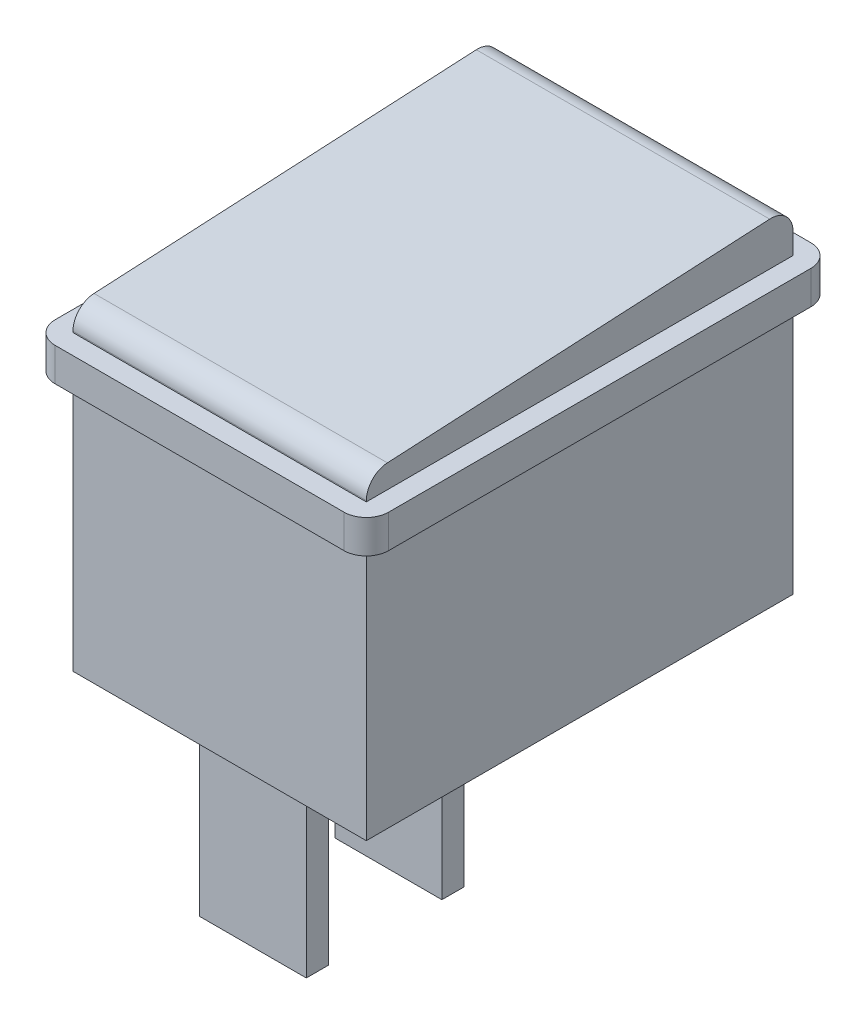
ISO-10303-21;
HEADER;
FILE_DESCRIPTION(('STEP AP214'),'2;1');
FILE_NAME('part.step','',(''),(''),'','','');
FILE_SCHEMA(('AUTOMOTIVE_DESIGN { 1 0 10303 214 1 1 1 1 }'));
ENDSEC;
DATA;
#1=APPLICATION_CONTEXT('core data for automotive mechanical design processes');
#2=APPLICATION_PROTOCOL_DEFINITION('international standard','automotive_design',2000,#1);
#3=PRODUCT_CONTEXT('',#1,'mechanical');
#4=PRODUCT('Part','Part','',(#3));
#5=PRODUCT_RELATED_PRODUCT_CATEGORY('part','',(#4));
#6=PRODUCT_DEFINITION_FORMATION('','',#4);
#7=PRODUCT_DEFINITION_CONTEXT('part definition',#1,'design');
#8=PRODUCT_DEFINITION('design','',#6,#7);
#9=PRODUCT_DEFINITION_SHAPE('','',#8);
#10=(LENGTH_UNIT() NAMED_UNIT(*) SI_UNIT(.MILLI.,.METRE.));
#11=(NAMED_UNIT(*) PLANE_ANGLE_UNIT() SI_UNIT($,.RADIAN.));
#12=(NAMED_UNIT(*) SI_UNIT($,.STERADIAN.) SOLID_ANGLE_UNIT());
#13=UNCERTAINTY_MEASURE_WITH_UNIT(LENGTH_MEASURE(1.E-05),#10,'distance_accuracy_value','');
#14=(GEOMETRIC_REPRESENTATION_CONTEXT(3) GLOBAL_UNCERTAINTY_ASSIGNED_CONTEXT((#13)) GLOBAL_UNIT_ASSIGNED_CONTEXT((#10,
#11,#12)) REPRESENTATION_CONTEXT('',''));
#15=CARTESIAN_POINT('',(0.,0.,0.));
#16=DIRECTION('',(0.,0.,1.));
#17=DIRECTION('',(1.,0.,0.));
#18=AXIS2_PLACEMENT_3D('',#15,#16,#17);
#19=CARTESIAN_POINT('',(0.,0.,0.));
#20=DIRECTION('',(0.,-1.,0.));
#21=DIRECTION('',(0.,0.,-1.));
#22=AXIS2_PLACEMENT_3D('',#19,#20,#21);
#23=PLANE('',#22);
#24=DIRECTION('',(0.,0.,-1.));
#25=VECTOR('',#24,1.);
#26=CARTESIAN_POINT('',(6.6,0.,9.6));
#27=LINE('',#26,#25);
#28=CARTESIAN_POINT('',(6.6,0.,9.6));
#29=VERTEX_POINT('',#28);
#30=CARTESIAN_POINT('',(6.6,0.,-9.6));
#31=VERTEX_POINT('',#30);
#32=EDGE_CURVE('E310',#29,#31,#27,.T.);
#33=ORIENTED_EDGE('',*,*,#32,.F.);
#34=DIRECTION('',(1.,0.,0.));
#35=VECTOR('',#34,1.);
#36=CARTESIAN_POINT('',(-6.6,0.,9.6));
#37=LINE('',#36,#35);
#38=CARTESIAN_POINT('',(-6.6,0.,9.6));
#39=VERTEX_POINT('',#38);
#40=EDGE_CURVE('E324',#39,#29,#37,.T.);
#41=ORIENTED_EDGE('',*,*,#40,.F.);
#42=DIRECTION('',(0.,0.,1.));
#43=VECTOR('',#42,1.);
#44=CARTESIAN_POINT('',(-6.6,0.,9.6));
#45=LINE('',#44,#43);
#46=CARTESIAN_POINT('',(-6.6,0.,-9.6));
#47=VERTEX_POINT('',#46);
#48=EDGE_CURVE('E338',#47,#39,#45,.T.);
#49=ORIENTED_EDGE('',*,*,#48,.F.);
#50=DIRECTION('',(-1.,0.,0.));
#51=VECTOR('',#50,1.);
#52=CARTESIAN_POINT('',(-6.6,0.,-9.6));
#53=LINE('',#52,#51);
#54=EDGE_CURVE('E336',#31,#47,#53,.T.);
#55=ORIENTED_EDGE('',*,*,#54,.F.);
#56=EDGE_LOOP('',(#33,#41,#49,#55));
#57=FACE_BOUND('',#56,.T.);
#58=DIRECTION('',(-1.,0.,0.));
#59=VECTOR('',#58,1.);
#60=CARTESIAN_POINT('',(-2.4,0.,2.));
#61=LINE('',#60,#59);
#62=CARTESIAN_POINT('',(2.4,0.,2.));
#63=VERTEX_POINT('',#62);
#64=CARTESIAN_POINT('',(-2.4,0.,2.));
#65=VERTEX_POINT('',#64);
#66=EDGE_CURVE('E264',#63,#65,#61,.T.);
#67=ORIENTED_EDGE('',*,*,#66,.F.);
#68=DIRECTION('',(0.,0.,1.));
#69=VECTOR('',#68,1.);
#70=CARTESIAN_POINT('',(2.4,0.,2.));
#71=LINE('',#70,#69);
#72=CARTESIAN_POINT('',(2.4,0.,1.));
#73=VERTEX_POINT('',#72);
#74=EDGE_CURVE('E266',#73,#63,#71,.T.);
#75=ORIENTED_EDGE('',*,*,#74,.F.);
#76=DIRECTION('',(1.,0.,0.));
#77=VECTOR('',#76,1.);
#78=CARTESIAN_POINT('',(-2.4,0.,1.));
#79=LINE('',#78,#77);
#80=CARTESIAN_POINT('',(-2.4,0.,1.));
#81=VERTEX_POINT('',#80);
#82=EDGE_CURVE('E258',#81,#73,#79,.T.);
#83=ORIENTED_EDGE('',*,*,#82,.F.);
#84=DIRECTION('',(0.,0.,-1.));
#85=VECTOR('',#84,1.);
#86=CARTESIAN_POINT('',(-2.4,0.,2.));
#87=LINE('',#86,#85);
#88=EDGE_CURVE('E260',#65,#81,#87,.T.);
#89=ORIENTED_EDGE('',*,*,#88,.F.);
#90=EDGE_LOOP('',(#67,#75,#83,#89));
#91=FACE_BOUND('',#90,.T.);
#92=DIRECTION('',(-1.,0.,0.));
#93=VECTOR('',#92,1.);
#94=CARTESIAN_POINT('',(-2.4,0.,8.1));
#95=LINE('',#94,#93);
#96=CARTESIAN_POINT('',(2.4,0.,8.1));
#97=VERTEX_POINT('',#96);
#98=CARTESIAN_POINT('',(-2.4,0.,8.1));
#99=VERTEX_POINT('',#98);
#100=EDGE_CURVE('E763',#97,#99,#95,.T.);
#101=ORIENTED_EDGE('',*,*,#100,.F.);
#102=DIRECTION('',(0.,0.,1.));
#103=VECTOR('',#102,1.);
#104=CARTESIAN_POINT('',(2.4,0.,8.1));
#105=LINE('',#104,#103);
#106=CARTESIAN_POINT('',(2.4,0.,7.1));
#107=VERTEX_POINT('',#106);
#108=EDGE_CURVE('E236',#107,#97,#105,.T.);
#109=ORIENTED_EDGE('',*,*,#108,.F.);
#110=DIRECTION('',(1.,0.,0.));
#111=VECTOR('',#110,1.);
#112=CARTESIAN_POINT('',(-2.4,0.,7.1));
#113=LINE('',#112,#111);
#114=CARTESIAN_POINT('',(-2.4,0.,7.1));
#115=VERTEX_POINT('',#114);
#116=EDGE_CURVE('E232',#115,#107,#113,.T.);
#117=ORIENTED_EDGE('',*,*,#116,.F.);
#118=DIRECTION('',(0.,0.,-1.));
#119=VECTOR('',#118,1.);
#120=CARTESIAN_POINT('',(-2.4,0.,8.1));
#121=LINE('',#120,#119);
#122=EDGE_CURVE('E766',#99,#115,#121,.T.);
#123=ORIENTED_EDGE('',*,*,#122,.F.);
#124=EDGE_LOOP('',(#101,#109,#117,#123));
#125=FACE_BOUND('',#124,.T.);
#126=ADVANCED_FACE('F39',(#57,#91,#125),#23,.T.);
#127=CARTESIAN_POINT('',(0.,13.2,0.));
#128=DIRECTION('',(0.,-1.,0.));
#129=DIRECTION('',(0.,0.,-1.));
#130=AXIS2_PLACEMENT_3D('',#127,#128,#129);
#131=PLANE('',#130);
#132=DIRECTION('',(0.,0.,1.));
#133=VECTOR('',#132,1.);
#134=CARTESIAN_POINT('',(-7.5,13.2,10.5));
#135=LINE('',#134,#133);
#136=CARTESIAN_POINT('',(-7.5,13.2,-9.5));
#137=VERTEX_POINT('',#136);
#138=CARTESIAN_POINT('',(-7.5,13.2,9.5));
#139=VERTEX_POINT('',#138);
#140=EDGE_CURVE('E304',#137,#139,#135,.T.);
#141=ORIENTED_EDGE('',*,*,#140,.T.);
#142=CARTESIAN_POINT('',(-6.5,13.2,9.5));
#143=DIRECTION('',(0.,-1.,0.));
#144=DIRECTION('',(0.,0.,-1.));
#145=AXIS2_PLACEMENT_3D('',#142,#143,#144);
#146=CIRCLE('',#145,1.);
#147=CARTESIAN_POINT('',(-6.5,13.2,10.5));
#148=VERTEX_POINT('',#147);
#149=EDGE_CURVE('E393',#139,#148,#146,.F.);
#150=ORIENTED_EDGE('',*,*,#149,.T.);
#151=DIRECTION('',(1.,0.,0.));
#152=VECTOR('',#151,1.);
#153=CARTESIAN_POINT('',(-7.5,13.2,10.5));
#154=LINE('',#153,#152);
#155=CARTESIAN_POINT('',(6.5,13.2,10.5));
#156=VERTEX_POINT('',#155);
#157=EDGE_CURVE('E307',#148,#156,#154,.T.);
#158=ORIENTED_EDGE('',*,*,#157,.T.);
#159=CARTESIAN_POINT('',(6.5,13.2,9.5));
#160=DIRECTION('',(0.,-1.,0.));
#161=DIRECTION('',(0.,0.,-1.));
#162=AXIS2_PLACEMENT_3D('',#159,#160,#161);
#163=CIRCLE('',#162,1.);
#164=CARTESIAN_POINT('',(7.5,13.2,9.5));
#165=VERTEX_POINT('',#164);
#166=EDGE_CURVE('E388',#156,#165,#163,.F.);
#167=ORIENTED_EDGE('',*,*,#166,.T.);
#168=DIRECTION('',(0.,0.,-1.));
#169=VECTOR('',#168,1.);
#170=CARTESIAN_POINT('',(7.5,13.2,10.5));
#171=LINE('',#170,#169);
#172=CARTESIAN_POINT('',(7.5,13.2,-9.5));
#173=VERTEX_POINT('',#172);
#174=EDGE_CURVE('E299',#165,#173,#171,.T.);
#175=ORIENTED_EDGE('',*,*,#174,.T.);
#176=CARTESIAN_POINT('',(6.5,13.2,-9.5));
#177=DIRECTION('',(0.,-1.,0.));
#178=DIRECTION('',(0.,0.,-1.));
#179=AXIS2_PLACEMENT_3D('',#176,#177,#178);
#180=CIRCLE('',#179,1.);
#181=CARTESIAN_POINT('',(6.5,13.2,-10.5));
#182=VERTEX_POINT('',#181);
#183=EDGE_CURVE('E61',#173,#182,#180,.F.);
#184=ORIENTED_EDGE('',*,*,#183,.T.);
#185=DIRECTION('',(-1.,0.,0.));
#186=VECTOR('',#185,1.);
#187=CARTESIAN_POINT('',(-7.5,13.2,-10.5));
#188=LINE('',#187,#186);
#189=CARTESIAN_POINT('',(-6.5,13.2,-10.5));
#190=VERTEX_POINT('',#189);
#191=EDGE_CURVE('E301',#182,#190,#188,.T.);
#192=ORIENTED_EDGE('',*,*,#191,.T.);
#193=CARTESIAN_POINT('',(-6.5,13.2,-9.5));
#194=DIRECTION('',(0.,-1.,0.));
#195=DIRECTION('',(0.,0.,-1.));
#196=AXIS2_PLACEMENT_3D('',#193,#194,#195);
#197=CIRCLE('',#196,1.);
#198=EDGE_CURVE('E391',#190,#137,#197,.F.);
#199=ORIENTED_EDGE('',*,*,#198,.T.);
#200=EDGE_LOOP('',(#141,#150,#158,#167,#175,#184,#192,#199));
#201=FACE_BOUND('',#200,.T.);
#202=DIRECTION('',(0.,0.,1.));
#203=VECTOR('',#202,1.);
#204=CARTESIAN_POINT('',(-6.6,13.2,9.6));
#205=LINE('',#204,#203);
#206=CARTESIAN_POINT('',(-6.6,13.2,-9.59999999999999));
#207=VERTEX_POINT('',#206);
#208=CARTESIAN_POINT('',(-6.6,13.2,9.6));
#209=VERTEX_POINT('',#208);
#210=EDGE_CURVE('E277',#207,#209,#205,.T.);
#211=ORIENTED_EDGE('',*,*,#210,.F.);
#212=DIRECTION('',(-1.,0.,0.));
#213=VECTOR('',#212,1.);
#214=CARTESIAN_POINT('',(6.6,13.2,-9.6));
#215=LINE('',#214,#213);
#216=CARTESIAN_POINT('',(6.6,13.2,-9.6));
#217=VERTEX_POINT('',#216);
#218=EDGE_CURVE('E287',#217,#207,#215,.T.);
#219=ORIENTED_EDGE('',*,*,#218,.F.);
#220=DIRECTION('',(0.,0.,-1.));
#221=VECTOR('',#220,1.);
#222=CARTESIAN_POINT('',(6.6,13.2,9.6));
#223=LINE('',#222,#221);
#224=CARTESIAN_POINT('',(6.6,13.2,9.6));
#225=VERTEX_POINT('',#224);
#226=EDGE_CURVE('E284',#225,#217,#223,.T.);
#227=ORIENTED_EDGE('',*,*,#226,.F.);
#228=DIRECTION('',(1.,0.,0.));
#229=VECTOR('',#228,1.);
#230=CARTESIAN_POINT('',(6.6,13.2,9.6));
#231=LINE('',#230,#229);
#232=EDGE_CURVE('E281',#209,#225,#231,.T.);
#233=ORIENTED_EDGE('',*,*,#232,.F.);
#234=EDGE_LOOP('',(#211,#219,#227,#233));
#235=FACE_BOUND('',#234,.T.);
#236=ADVANCED_FACE('F416',(#201,#235),#131,.F.);
#237=CARTESIAN_POINT('',(6.6,11.7,9.6));
#238=DIRECTION('',(-1.,0.,0.));
#239=DIRECTION('',(0.,0.,1.));
#240=AXIS2_PLACEMENT_3D('',#237,#238,#239);
#241=PLANE('',#240);
#242=ORIENTED_EDGE('',*,*,#32,.T.);
#243=DIRECTION('',(0.,-1.,0.));
#244=VECTOR('',#243,1.);
#245=CARTESIAN_POINT('',(6.6,11.7,-9.6));
#246=LINE('',#245,#244);
#247=CARTESIAN_POINT('',(6.6,11.7,-9.6));
#248=VERTEX_POINT('',#247);
#249=EDGE_CURVE('E349',#248,#31,#246,.T.);
#250=ORIENTED_EDGE('',*,*,#249,.F.);
#251=DIRECTION('',(0.,0.,-1.));
#252=VECTOR('',#251,1.);
#253=CARTESIAN_POINT('',(6.6,11.7,9.6));
#254=LINE('',#253,#252);
#255=CARTESIAN_POINT('',(6.6,11.7,9.6));
#256=VERTEX_POINT('',#255);
#257=EDGE_CURVE('E320',#256,#248,#254,.T.);
#258=ORIENTED_EDGE('',*,*,#257,.F.);
#259=DIRECTION('',(0.,-1.,0.));
#260=VECTOR('',#259,1.);
#261=CARTESIAN_POINT('',(6.6,11.7,9.6));
#262=LINE('',#261,#260);
#263=EDGE_CURVE('E333',#256,#29,#262,.T.);
#264=ORIENTED_EDGE('',*,*,#263,.T.);
#265=EDGE_LOOP('',(#242,#250,#258,#264));
#266=FACE_BOUND('',#265,.T.);
#267=ADVANCED_FACE('F446',(#266),#241,.F.);
#268=CARTESIAN_POINT('',(-6.6,11.7,-9.6));
#269=DIRECTION('',(0.,0.,1.));
#270=DIRECTION('',(1.,0.,0.));
#271=AXIS2_PLACEMENT_3D('',#268,#269,#270);
#272=PLANE('',#271);
#273=ORIENTED_EDGE('',*,*,#54,.T.);
#274=DIRECTION('',(0.,-1.,0.));
#275=VECTOR('',#274,1.);
#276=CARTESIAN_POINT('',(-6.6,11.7,-9.6));
#277=LINE('',#276,#275);
#278=CARTESIAN_POINT('',(-6.6,11.7,-9.6));
#279=VERTEX_POINT('',#278);
#280=EDGE_CURVE('E346',#279,#47,#277,.T.);
#281=ORIENTED_EDGE('',*,*,#280,.F.);
#282=DIRECTION('',(-1.,0.,0.));
#283=VECTOR('',#282,1.);
#284=CARTESIAN_POINT('',(-6.6,11.7,-9.6));
#285=LINE('',#284,#283);
#286=EDGE_CURVE('E323',#248,#279,#285,.T.);
#287=ORIENTED_EDGE('',*,*,#286,.F.);
#288=ORIENTED_EDGE('',*,*,#249,.T.);
#289=EDGE_LOOP('',(#273,#281,#287,#288));
#290=FACE_BOUND('',#289,.T.);
#291=ADVANCED_FACE('F459',(#290),#272,.F.);
#292=CARTESIAN_POINT('',(-6.6,11.7,9.6));
#293=DIRECTION('',(1.,0.,0.));
#294=DIRECTION('',(0.,0.,-1.));
#295=AXIS2_PLACEMENT_3D('',#292,#293,#294);
#296=PLANE('',#295);
#297=ORIENTED_EDGE('',*,*,#48,.T.);
#298=DIRECTION('',(0.,-1.,0.));
#299=VECTOR('',#298,1.);
#300=CARTESIAN_POINT('',(-6.6,11.7,9.6));
#301=LINE('',#300,#299);
#302=CARTESIAN_POINT('',(-6.6,11.7,9.6));
#303=VERTEX_POINT('',#302);
#304=EDGE_CURVE('E343',#303,#39,#301,.T.);
#305=ORIENTED_EDGE('',*,*,#304,.F.);
#306=DIRECTION('',(0.,0.,1.));
#307=VECTOR('',#306,1.);
#308=CARTESIAN_POINT('',(-6.6,11.7,9.6));
#309=LINE('',#308,#307);
#310=EDGE_CURVE('E327',#279,#303,#309,.T.);
#311=ORIENTED_EDGE('',*,*,#310,.F.);
#312=ORIENTED_EDGE('',*,*,#280,.T.);
#313=EDGE_LOOP('',(#297,#305,#311,#312));
#314=FACE_BOUND('',#313,.T.);
#315=ADVANCED_FACE('F455',(#314),#296,.F.);
#316=CARTESIAN_POINT('',(-6.6,11.7,9.6));
#317=DIRECTION('',(0.,0.,-1.));
#318=DIRECTION('',(-1.,0.,0.));
#319=AXIS2_PLACEMENT_3D('',#316,#317,#318);
#320=PLANE('',#319);
#321=ORIENTED_EDGE('',*,*,#40,.T.);
#322=ORIENTED_EDGE('',*,*,#263,.F.);
#323=DIRECTION('',(1.,0.,0.));
#324=VECTOR('',#323,1.);
#325=CARTESIAN_POINT('',(-6.6,11.7,9.6));
#326=LINE('',#325,#324);
#327=EDGE_CURVE('E330',#303,#256,#326,.T.);
#328=ORIENTED_EDGE('',*,*,#327,.F.);
#329=ORIENTED_EDGE('',*,*,#304,.T.);
#330=EDGE_LOOP('',(#321,#322,#328,#329));
#331=FACE_BOUND('',#330,.T.);
#332=ADVANCED_FACE('F453',(#331),#320,.F.);
#333=CARTESIAN_POINT('',(7.5,13.2,10.5));
#334=DIRECTION('',(-1.,0.,0.));
#335=DIRECTION('',(0.,0.,1.));
#336=AXIS2_PLACEMENT_3D('',#333,#334,#335);
#337=PLANE('',#336);
#338=DIRECTION('',(0.,0.,-1.));
#339=VECTOR('',#338,1.);
#340=CARTESIAN_POINT('',(7.5,11.7,10.5));
#341=LINE('',#340,#339);
#342=CARTESIAN_POINT('',(7.5,11.7,9.5));
#343=VERTEX_POINT('',#342);
#344=CARTESIAN_POINT('',(7.5,11.7,-9.5));
#345=VERTEX_POINT('',#344);
#346=EDGE_CURVE('E298',#343,#345,#341,.T.);
#347=ORIENTED_EDGE('',*,*,#346,.T.);
#348=DIRECTION('',(0.,-1.,0.));
#349=VECTOR('',#348,1.);
#350=CARTESIAN_POINT('',(7.5,13.2,-9.5));
#351=LINE('',#350,#349);
#352=EDGE_CURVE('E11',#345,#173,#351,.F.);
#353=ORIENTED_EDGE('',*,*,#352,.T.);
#354=ORIENTED_EDGE('',*,*,#174,.F.);
#355=DIRECTION('',(0.,-1.,0.));
#356=VECTOR('',#355,1.);
#357=CARTESIAN_POINT('',(7.5,13.2,9.5));
#358=LINE('',#357,#356);
#359=EDGE_CURVE('E47',#165,#343,#358,.T.);
#360=ORIENTED_EDGE('',*,*,#359,.T.);
#361=EDGE_LOOP('',(#347,#353,#354,#360));
#362=FACE_BOUND('',#361,.T.);
#363=ADVANCED_FACE('F403',(#362),#337,.F.);
#364=CARTESIAN_POINT('',(-7.5,13.2,-10.5));
#365=DIRECTION('',(0.,0.,1.));
#366=DIRECTION('',(1.,0.,0.));
#367=AXIS2_PLACEMENT_3D('',#364,#365,#366);
#368=PLANE('',#367);
#369=DIRECTION('',(-1.,0.,0.));
#370=VECTOR('',#369,1.);
#371=CARTESIAN_POINT('',(-7.5,11.7,-10.5));
#372=LINE('',#371,#370);
#373=CARTESIAN_POINT('',(6.5,11.7,-10.5));
#374=VERTEX_POINT('',#373);
#375=CARTESIAN_POINT('',(-6.5,11.7,-10.5));
#376=VERTEX_POINT('',#375);
#377=EDGE_CURVE('E313',#374,#376,#372,.T.);
#378=ORIENTED_EDGE('',*,*,#377,.T.);
#379=DIRECTION('',(0.,-1.,0.));
#380=VECTOR('',#379,1.);
#381=CARTESIAN_POINT('',(-6.5,13.2,-10.5));
#382=LINE('',#381,#380);
#383=EDGE_CURVE('E54',#376,#190,#382,.F.);
#384=ORIENTED_EDGE('',*,*,#383,.T.);
#385=ORIENTED_EDGE('',*,*,#191,.F.);
#386=DIRECTION('',(0.,-1.,0.));
#387=VECTOR('',#386,1.);
#388=CARTESIAN_POINT('',(6.5,13.2,-10.5));
#389=LINE('',#388,#387);
#390=EDGE_CURVE('E395',#182,#374,#389,.T.);
#391=ORIENTED_EDGE('',*,*,#390,.T.);
#392=EDGE_LOOP('',(#378,#384,#385,#391));
#393=FACE_BOUND('',#392,.T.);
#394=ADVANCED_FACE('F414',(#393),#368,.F.);
#395=CARTESIAN_POINT('',(-7.5,13.2,10.5));
#396=DIRECTION('',(1.,0.,0.));
#397=DIRECTION('',(0.,0.,-1.));
#398=AXIS2_PLACEMENT_3D('',#395,#396,#397);
#399=PLANE('',#398);
#400=DIRECTION('',(0.,0.,1.));
#401=VECTOR('',#400,1.);
#402=CARTESIAN_POINT('',(-7.5,11.7,10.5));
#403=LINE('',#402,#401);
#404=CARTESIAN_POINT('',(-7.5,11.7,-9.5));
#405=VERTEX_POINT('',#404);
#406=CARTESIAN_POINT('',(-7.5,11.7,9.5));
#407=VERTEX_POINT('',#406);
#408=EDGE_CURVE('E315',#405,#407,#403,.T.);
#409=ORIENTED_EDGE('',*,*,#408,.T.);
#410=DIRECTION('',(0.,-1.,0.));
#411=VECTOR('',#410,1.);
#412=CARTESIAN_POINT('',(-7.5,13.2,9.5));
#413=LINE('',#412,#411);
#414=EDGE_CURVE('E386',#407,#139,#413,.F.);
#415=ORIENTED_EDGE('',*,*,#414,.T.);
#416=ORIENTED_EDGE('',*,*,#140,.F.);
#417=DIRECTION('',(0.,-1.,0.));
#418=VECTOR('',#417,1.);
#419=CARTESIAN_POINT('',(-7.5,13.2,-9.5));
#420=LINE('',#419,#418);
#421=EDGE_CURVE('E383',#137,#405,#420,.T.);
#422=ORIENTED_EDGE('',*,*,#421,.T.);
#423=EDGE_LOOP('',(#409,#415,#416,#422));
#424=FACE_BOUND('',#423,.T.);
#425=ADVANCED_FACE('F424',(#424),#399,.F.);
#426=CARTESIAN_POINT('',(-7.5,13.2,10.5));
#427=DIRECTION('',(0.,0.,-1.));
#428=DIRECTION('',(-1.,0.,0.));
#429=AXIS2_PLACEMENT_3D('',#426,#427,#428);
#430=PLANE('',#429);
#431=ORIENTED_EDGE('',*,*,#157,.F.);
#432=DIRECTION('',(0.,-1.,0.));
#433=VECTOR('',#432,1.);
#434=CARTESIAN_POINT('',(-6.5,13.2,10.5));
#435=LINE('',#434,#433);
#436=CARTESIAN_POINT('',(-6.5,11.7,10.5));
#437=VERTEX_POINT('',#436);
#438=EDGE_CURVE('E372',#148,#437,#435,.T.);
#439=ORIENTED_EDGE('',*,*,#438,.T.);
#440=DIRECTION('',(1.,0.,0.));
#441=VECTOR('',#440,1.);
#442=CARTESIAN_POINT('',(-7.5,11.7,10.5));
#443=LINE('',#442,#441);
#444=CARTESIAN_POINT('',(6.5,11.7,10.5));
#445=VERTEX_POINT('',#444);
#446=EDGE_CURVE('E302',#437,#445,#443,.T.);
#447=ORIENTED_EDGE('',*,*,#446,.T.);
#448=DIRECTION('',(0.,-1.,0.));
#449=VECTOR('',#448,1.);
#450=CARTESIAN_POINT('',(6.5,13.2,10.5));
#451=LINE('',#450,#449);
#452=EDGE_CURVE('E370',#445,#156,#451,.F.);
#453=ORIENTED_EDGE('',*,*,#452,.T.);
#454=EDGE_LOOP('',(#431,#439,#447,#453));
#455=FACE_BOUND('',#454,.T.);
#456=ADVANCED_FACE('F432',(#455),#430,.F.);
#457=CARTESIAN_POINT('',(0.,11.7,0.));
#458=DIRECTION('',(0.,-1.,0.));
#459=DIRECTION('',(0.,0.,-1.));
#460=AXIS2_PLACEMENT_3D('',#457,#458,#459);
#461=PLANE('',#460);
#462=ORIENTED_EDGE('',*,*,#327,.T.);
#463=ORIENTED_EDGE('',*,*,#257,.T.);
#464=ORIENTED_EDGE('',*,*,#286,.T.);
#465=ORIENTED_EDGE('',*,*,#310,.T.);
#466=EDGE_LOOP('',(#462,#463,#464,#465));
#467=FACE_BOUND('',#466,.T.);
#468=ORIENTED_EDGE('',*,*,#446,.F.);
#469=CARTESIAN_POINT('',(-6.5,11.7,9.5));
#470=DIRECTION('',(0.,-1.,0.));
#471=DIRECTION('',(0.,0.,-1.));
#472=AXIS2_PLACEMENT_3D('',#469,#470,#471);
#473=CIRCLE('',#472,1.);
#474=EDGE_CURVE('E381',#437,#407,#473,.T.);
#475=ORIENTED_EDGE('',*,*,#474,.T.);
#476=ORIENTED_EDGE('',*,*,#408,.F.);
#477=CARTESIAN_POINT('',(-6.5,11.7,-9.5));
#478=DIRECTION('',(0.,-1.,0.));
#479=DIRECTION('',(0.,0.,-1.));
#480=AXIS2_PLACEMENT_3D('',#477,#478,#479);
#481=CIRCLE('',#480,1.);
#482=EDGE_CURVE('E379',#405,#376,#481,.T.);
#483=ORIENTED_EDGE('',*,*,#482,.T.);
#484=ORIENTED_EDGE('',*,*,#377,.F.);
#485=CARTESIAN_POINT('',(6.5,11.7,-9.5));
#486=DIRECTION('',(0.,-1.,0.));
#487=DIRECTION('',(0.,0.,-1.));
#488=AXIS2_PLACEMENT_3D('',#485,#486,#487);
#489=CIRCLE('',#488,1.);
#490=EDGE_CURVE('E377',#374,#345,#489,.T.);
#491=ORIENTED_EDGE('',*,*,#490,.T.);
#492=ORIENTED_EDGE('',*,*,#346,.F.);
#493=CARTESIAN_POINT('',(6.5,11.7,9.5));
#494=DIRECTION('',(0.,-1.,0.));
#495=DIRECTION('',(0.,0.,-1.));
#496=AXIS2_PLACEMENT_3D('',#493,#494,#495);
#497=CIRCLE('',#496,1.);
#498=EDGE_CURVE('E375',#343,#445,#497,.T.);
#499=ORIENTED_EDGE('',*,*,#498,.T.);
#500=EDGE_LOOP('',(#468,#475,#476,#483,#484,#491,#492,#499));
#501=FACE_BOUND('',#500,.T.);
#502=ADVANCED_FACE('F409',(#467,#501),#461,.T.);
#503=CARTESIAN_POINT('',(-6.6,18.2,9.6));
#504=DIRECTION('',(1.,0.,0.));
#505=DIRECTION('',(0.,0.,-1.));
#506=AXIS2_PLACEMENT_3D('',#503,#504,#505);
#507=PLANE('',#506);
#508=DIRECTION('',(0.,-1.,0.));
#509=VECTOR('',#508,1.);
#510=CARTESIAN_POINT('',(-6.6,18.2,9.6));
#511=LINE('',#510,#509);
#512=CARTESIAN_POINT('',(-6.6,13.2507279151071,9.6));
#513=VERTEX_POINT('',#512);
#514=EDGE_CURVE('E296',#513,#209,#511,.T.);
#515=ORIENTED_EDGE('',*,*,#514,.F.);
#516=CARTESIAN_POINT('',(-6.6,13.2507279151071,8.6));
#517=DIRECTION('',(1.,0.,0.));
#518=DIRECTION('',(0.,0.,-1.));
#519=AXIS2_PLACEMENT_3D('',#516,#517,#518);
#520=CIRCLE('',#519,1.);
#521=CARTESIAN_POINT('',(-6.6,14.2493743315526,8.65201283418987));
#522=VERTEX_POINT('',#521);
#523=EDGE_CURVE('E365',#513,#522,#520,.F.);
#524=ORIENTED_EDGE('',*,*,#523,.T.);
#525=DIRECTION('',(0.,-0.0520128341898725,0.998646416445549));
#526=VECTOR('',#525,1.);
#527=CARTESIAN_POINT('',(-6.6,15.2,-9.6));
#528=LINE('',#527,#526);
#529=CARTESIAN_POINT('',(-6.6,15.1452076648859,-8.54798716581012));
#530=VERTEX_POINT('',#529);
#531=EDGE_CURVE('E241',#530,#522,#528,.T.);
#532=ORIENTED_EDGE('',*,*,#531,.F.);
#533=CARTESIAN_POINT('',(-6.6,14.1465612484404,-8.59999999999999));
#534=DIRECTION('',(1.,0.,0.));
#535=DIRECTION('',(0.,0.,-1.));
#536=AXIS2_PLACEMENT_3D('',#533,#534,#535);
#537=CIRCLE('',#536,1.);
#538=CARTESIAN_POINT('',(-6.6,14.1465612484404,-9.59999999999999));
#539=VERTEX_POINT('',#538);
#540=EDGE_CURVE('E363',#530,#539,#537,.F.);
#541=ORIENTED_EDGE('',*,*,#540,.T.);
#542=DIRECTION('',(0.,-1.,0.));
#543=VECTOR('',#542,1.);
#544=CARTESIAN_POINT('',(-6.6,18.2,-9.59999999999999));
#545=LINE('',#544,#543);
#546=EDGE_CURVE('E290',#539,#207,#545,.T.);
#547=ORIENTED_EDGE('',*,*,#546,.T.);
#548=ORIENTED_EDGE('',*,*,#210,.T.);
#549=EDGE_LOOP('',(#515,#524,#532,#541,#547,#548));
#550=FACE_BOUND('',#549,.T.);
#551=ADVANCED_FACE('F630',(#550),#507,.F.);
#552=CARTESIAN_POINT('',(6.6,18.2,9.6));
#553=DIRECTION('',(0.,0.,-1.));
#554=DIRECTION('',(-1.,0.,0.));
#555=AXIS2_PLACEMENT_3D('',#552,#553,#554);
#556=PLANE('',#555);
#557=DIRECTION('',(0.,-1.,0.));
#558=VECTOR('',#557,1.);
#559=CARTESIAN_POINT('',(6.6,18.2,9.6));
#560=LINE('',#559,#558);
#561=CARTESIAN_POINT('',(6.6,13.2507279151071,9.6));
#562=VERTEX_POINT('',#561);
#563=EDGE_CURVE('E294',#562,#225,#560,.T.);
#564=ORIENTED_EDGE('',*,*,#563,.F.);
#565=DIRECTION('',(1.,0.,0.));
#566=VECTOR('',#565,1.);
#567=CARTESIAN_POINT('',(6.6,13.2507279151071,9.6));
#568=LINE('',#567,#566);
#569=EDGE_CURVE('E361',#562,#513,#568,.F.);
#570=ORIENTED_EDGE('',*,*,#569,.T.);
#571=ORIENTED_EDGE('',*,*,#514,.T.);
#572=ORIENTED_EDGE('',*,*,#232,.T.);
#573=EDGE_LOOP('',(#564,#570,#571,#572));
#574=FACE_BOUND('',#573,.T.);
#575=ADVANCED_FACE('F621',(#574),#556,.F.);
#576=CARTESIAN_POINT('',(6.6,18.2,9.6));
#577=DIRECTION('',(-1.,0.,0.));
#578=DIRECTION('',(0.,0.,1.));
#579=AXIS2_PLACEMENT_3D('',#576,#577,#578);
#580=PLANE('',#579);
#581=DIRECTION('',(0.,0.0520128341898725,-0.998646416445549));
#582=VECTOR('',#581,1.);
#583=CARTESIAN_POINT('',(6.6,15.2,-9.6));
#584=LINE('',#583,#582);
#585=CARTESIAN_POINT('',(6.6,14.2493743315526,8.65201283418987));
#586=VERTEX_POINT('',#585);
#587=CARTESIAN_POINT('',(6.6,15.1452076648859,-8.54798716581012));
#588=VERTEX_POINT('',#587);
#589=EDGE_CURVE('E238',#586,#588,#584,.T.);
#590=ORIENTED_EDGE('',*,*,#589,.F.);
#591=CARTESIAN_POINT('',(6.6,13.2507279151071,8.6));
#592=DIRECTION('',(-1.,0.,0.));
#593=DIRECTION('',(0.,0.,1.));
#594=AXIS2_PLACEMENT_3D('',#591,#592,#593);
#595=CIRCLE('',#594,1.);
#596=EDGE_CURVE('E359',#586,#562,#595,.F.);
#597=ORIENTED_EDGE('',*,*,#596,.T.);
#598=ORIENTED_EDGE('',*,*,#563,.T.);
#599=ORIENTED_EDGE('',*,*,#226,.T.);
#600=DIRECTION('',(0.,-1.,0.));
#601=VECTOR('',#600,1.);
#602=CARTESIAN_POINT('',(6.6,18.2,-9.6));
#603=LINE('',#602,#601);
#604=CARTESIAN_POINT('',(6.6,14.1465612484404,-9.6));
#605=VERTEX_POINT('',#604);
#606=EDGE_CURVE('E292',#605,#217,#603,.T.);
#607=ORIENTED_EDGE('',*,*,#606,.F.);
#608=CARTESIAN_POINT('',(6.6,14.1465612484404,-8.6));
#609=DIRECTION('',(-1.,0.,0.));
#610=DIRECTION('',(0.,0.,1.));
#611=AXIS2_PLACEMENT_3D('',#608,#609,#610);
#612=CIRCLE('',#611,1.);
#613=EDGE_CURVE('E357',#605,#588,#612,.F.);
#614=ORIENTED_EDGE('',*,*,#613,.T.);
#615=EDGE_LOOP('',(#590,#597,#598,#599,#607,#614));
#616=FACE_BOUND('',#615,.T.);
#617=ADVANCED_FACE('F612',(#616),#580,.F.);
#618=CARTESIAN_POINT('',(6.6,18.2,-9.6));
#619=DIRECTION('',(0.,0.,1.));
#620=DIRECTION('',(1.,0.,0.));
#621=AXIS2_PLACEMENT_3D('',#618,#619,#620);
#622=PLANE('',#621);
#623=ORIENTED_EDGE('',*,*,#546,.F.);
#624=DIRECTION('',(1.,0.,0.));
#625=VECTOR('',#624,1.);
#626=CARTESIAN_POINT('',(6.6,14.1465612484404,-9.6));
#627=LINE('',#626,#625);
#628=EDGE_CURVE('E367',#539,#605,#627,.T.);
#629=ORIENTED_EDGE('',*,*,#628,.T.);
#630=ORIENTED_EDGE('',*,*,#606,.T.);
#631=ORIENTED_EDGE('',*,*,#218,.T.);
#632=EDGE_LOOP('',(#623,#629,#630,#631));
#633=FACE_BOUND('',#632,.T.);
#634=ADVANCED_FACE('F603',(#633),#622,.F.);
#635=CARTESIAN_POINT('',(-26.21224107541,15.2,-9.6));
#636=DIRECTION('',(0.,-0.998646416445549,-0.0520128341898725));
#637=DIRECTION('',(0.,0.0520128341898725,-0.998646416445549));
#638=AXIS2_PLACEMENT_3D('',#635,#636,#637);
#639=PLANE('',#638);
#640=ORIENTED_EDGE('',*,*,#531,.T.);
#641=DIRECTION('',(1.,0.,0.));
#642=VECTOR('',#641,1.);
#643=CARTESIAN_POINT('',(-26.21224107541,14.2493743315526,8.65201283418987));
#644=LINE('',#643,#642);
#645=EDGE_CURVE('E354',#522,#586,#644,.T.);
#646=ORIENTED_EDGE('',*,*,#645,.T.);
#647=ORIENTED_EDGE('',*,*,#589,.T.);
#648=DIRECTION('',(1.,0.,0.));
#649=VECTOR('',#648,1.);
#650=CARTESIAN_POINT('',(-26.21224107541,15.1452076648859,-8.54798716581011));
#651=LINE('',#650,#649);
#652=EDGE_CURVE('E352',#588,#530,#651,.F.);
#653=ORIENTED_EDGE('',*,*,#652,.T.);
#654=EDGE_LOOP('',(#640,#646,#647,#653));
#655=FACE_BOUND('',#654,.T.);
#656=ADVANCED_FACE('F590',(#655),#639,.F.);
#657=CARTESIAN_POINT('',(2.4,-8.2,2.));
#658=DIRECTION('',(-1.,0.,0.));
#659=DIRECTION('',(0.,0.,1.));
#660=AXIS2_PLACEMENT_3D('',#657,#658,#659);
#661=PLANE('',#660);
#662=ORIENTED_EDGE('',*,*,#74,.T.);
#663=DIRECTION('',(0.,1.,0.));
#664=VECTOR('',#663,1.);
#665=CARTESIAN_POINT('',(2.4,-8.2,2.));
#666=LINE('',#665,#664);
#667=CARTESIAN_POINT('',(2.4,-8.2,2.));
#668=VERTEX_POINT('',#667);
#669=EDGE_CURVE('E247',#668,#63,#666,.T.);
#670=ORIENTED_EDGE('',*,*,#669,.F.);
#671=DIRECTION('',(0.,0.,1.));
#672=VECTOR('',#671,1.);
#673=CARTESIAN_POINT('',(2.4,-8.2,2.));
#674=LINE('',#673,#672);
#675=CARTESIAN_POINT('',(2.4,-8.2,1.));
#676=VERTEX_POINT('',#675);
#677=EDGE_CURVE('E261',#676,#668,#674,.T.);
#678=ORIENTED_EDGE('',*,*,#677,.F.);
#679=DIRECTION('',(0.,1.,0.));
#680=VECTOR('',#679,1.);
#681=CARTESIAN_POINT('',(2.4,-8.2,1.));
#682=LINE('',#681,#680);
#683=EDGE_CURVE('E254',#676,#73,#682,.T.);
#684=ORIENTED_EDGE('',*,*,#683,.T.);
#685=EDGE_LOOP('',(#662,#670,#678,#684));
#686=FACE_BOUND('',#685,.T.);
#687=ADVANCED_FACE('F582',(#686),#661,.F.);
#688=CARTESIAN_POINT('',(-2.4,-8.2,2.));
#689=DIRECTION('',(0.,0.,-1.));
#690=DIRECTION('',(-1.,0.,0.));
#691=AXIS2_PLACEMENT_3D('',#688,#689,#690);
#692=PLANE('',#691);
#693=ORIENTED_EDGE('',*,*,#66,.T.);
#694=DIRECTION('',(0.,1.,0.));
#695=VECTOR('',#694,1.);
#696=CARTESIAN_POINT('',(-2.4,-8.2,2.));
#697=LINE('',#696,#695);
#698=CARTESIAN_POINT('',(-2.4,-8.2,2.));
#699=VERTEX_POINT('',#698);
#700=EDGE_CURVE('E249',#699,#65,#697,.T.);
#701=ORIENTED_EDGE('',*,*,#700,.F.);
#702=DIRECTION('',(-1.,0.,0.));
#703=VECTOR('',#702,1.);
#704=CARTESIAN_POINT('',(-2.4,-8.2,2.));
#705=LINE('',#704,#703);
#706=EDGE_CURVE('E272',#668,#699,#705,.T.);
#707=ORIENTED_EDGE('',*,*,#706,.F.);
#708=ORIENTED_EDGE('',*,*,#669,.T.);
#709=EDGE_LOOP('',(#693,#701,#707,#708));
#710=FACE_BOUND('',#709,.T.);
#711=ADVANCED_FACE('F573',(#710),#692,.F.);
#712=CARTESIAN_POINT('',(-2.4,-8.2,2.));
#713=DIRECTION('',(1.,0.,0.));
#714=DIRECTION('',(0.,0.,-1.));
#715=AXIS2_PLACEMENT_3D('',#712,#713,#714);
#716=PLANE('',#715);
#717=ORIENTED_EDGE('',*,*,#88,.T.);
#718=DIRECTION('',(0.,1.,0.));
#719=VECTOR('',#718,1.);
#720=CARTESIAN_POINT('',(-2.4,-8.2,1.));
#721=LINE('',#720,#719);
#722=CARTESIAN_POINT('',(-2.4,-8.2,1.));
#723=VERTEX_POINT('',#722);
#724=EDGE_CURVE('E252',#723,#81,#721,.T.);
#725=ORIENTED_EDGE('',*,*,#724,.F.);
#726=DIRECTION('',(0.,0.,-1.));
#727=VECTOR('',#726,1.);
#728=CARTESIAN_POINT('',(-2.4,-8.2,2.));
#729=LINE('',#728,#727);
#730=EDGE_CURVE('E270',#699,#723,#729,.T.);
#731=ORIENTED_EDGE('',*,*,#730,.F.);
#732=ORIENTED_EDGE('',*,*,#700,.T.);
#733=EDGE_LOOP('',(#717,#725,#731,#732));
#734=FACE_BOUND('',#733,.T.);
#735=ADVANCED_FACE('F564',(#734),#716,.F.);
#736=CARTESIAN_POINT('',(-2.4,-8.2,1.));
#737=DIRECTION('',(0.,0.,1.));
#738=DIRECTION('',(1.,0.,0.));
#739=AXIS2_PLACEMENT_3D('',#736,#737,#738);
#740=PLANE('',#739);
#741=ORIENTED_EDGE('',*,*,#82,.T.);
#742=ORIENTED_EDGE('',*,*,#683,.F.);
#743=DIRECTION('',(1.,0.,0.));
#744=VECTOR('',#743,1.);
#745=CARTESIAN_POINT('',(-2.4,-8.2,1.));
#746=LINE('',#745,#744);
#747=EDGE_CURVE('E257',#723,#676,#746,.T.);
#748=ORIENTED_EDGE('',*,*,#747,.F.);
#749=ORIENTED_EDGE('',*,*,#724,.T.);
#750=EDGE_LOOP('',(#741,#742,#748,#749));
#751=FACE_BOUND('',#750,.T.);
#752=ADVANCED_FACE('F555',(#751),#740,.F.);
#753=CARTESIAN_POINT('',(0.,-8.2,0.));
#754=DIRECTION('',(0.,-1.,0.));
#755=DIRECTION('',(0.,0.,-1.));
#756=AXIS2_PLACEMENT_3D('',#753,#754,#755);
#757=PLANE('',#756);
#758=ORIENTED_EDGE('',*,*,#677,.T.);
#759=ORIENTED_EDGE('',*,*,#706,.T.);
#760=ORIENTED_EDGE('',*,*,#730,.T.);
#761=ORIENTED_EDGE('',*,*,#747,.T.);
#762=EDGE_LOOP('',(#758,#759,#760,#761));
#763=FACE_BOUND('',#762,.T.);
#764=ADVANCED_FACE('F547',(#763),#757,.T.);
#765=CARTESIAN_POINT('',(2.4,-8.2,8.1));
#766=DIRECTION('',(-1.,0.,0.));
#767=DIRECTION('',(0.,0.,1.));
#768=AXIS2_PLACEMENT_3D('',#765,#766,#767);
#769=PLANE('',#768);
#770=ORIENTED_EDGE('',*,*,#108,.T.);
#771=DIRECTION('',(0.,1.,0.));
#772=VECTOR('',#771,1.);
#773=CARTESIAN_POINT('',(2.4,-8.2,8.1));
#774=LINE('',#773,#772);
#775=CARTESIAN_POINT('',(2.4,-8.2,8.1));
#776=VERTEX_POINT('',#775);
#777=EDGE_CURVE('E216',#776,#97,#774,.T.);
#778=ORIENTED_EDGE('',*,*,#777,.F.);
#779=DIRECTION('',(0.,0.,1.));
#780=VECTOR('',#779,1.);
#781=CARTESIAN_POINT('',(2.4,-8.2,8.1));
#782=LINE('',#781,#780);
#783=CARTESIAN_POINT('',(2.4,-8.2,7.1));
#784=VERTEX_POINT('',#783);
#785=EDGE_CURVE('E223',#784,#776,#782,.T.);
#786=ORIENTED_EDGE('',*,*,#785,.F.);
#787=DIRECTION('',(0.,1.,0.));
#788=VECTOR('',#787,1.);
#789=CARTESIAN_POINT('',(2.4,-8.2,7.1));
#790=LINE('',#789,#788);
#791=EDGE_CURVE('E773',#784,#107,#790,.T.);
#792=ORIENTED_EDGE('',*,*,#791,.T.);
#793=EDGE_LOOP('',(#770,#778,#786,#792));
#794=FACE_BOUND('',#793,.T.);
#795=ADVANCED_FACE('F234',(#794),#769,.F.);
#796=CARTESIAN_POINT('',(-2.4,-8.2,8.1));
#797=DIRECTION('',(0.,0.,-1.));
#798=DIRECTION('',(-1.,0.,0.));
#799=AXIS2_PLACEMENT_3D('',#796,#797,#798);
#800=PLANE('',#799);
#801=ORIENTED_EDGE('',*,*,#100,.T.);
#802=DIRECTION('',(0.,1.,0.));
#803=VECTOR('',#802,1.);
#804=CARTESIAN_POINT('',(-2.4,-8.2,8.1));
#805=LINE('',#804,#803);
#806=CARTESIAN_POINT('',(-2.4,-8.2,8.1));
#807=VERTEX_POINT('',#806);
#808=EDGE_CURVE('E219',#807,#99,#805,.T.);
#809=ORIENTED_EDGE('',*,*,#808,.F.);
#810=DIRECTION('',(-1.,0.,0.));
#811=VECTOR('',#810,1.);
#812=CARTESIAN_POINT('',(-2.4,-8.2,8.1));
#813=LINE('',#812,#811);
#814=EDGE_CURVE('E212',#776,#807,#813,.T.);
#815=ORIENTED_EDGE('',*,*,#814,.F.);
#816=ORIENTED_EDGE('',*,*,#777,.T.);
#817=EDGE_LOOP('',(#801,#809,#815,#816));
#818=FACE_BOUND('',#817,.T.);
#819=ADVANCED_FACE('F214',(#818),#800,.F.);
#820=CARTESIAN_POINT('',(-2.4,-8.2,8.1));
#821=DIRECTION('',(1.,0.,0.));
#822=DIRECTION('',(0.,0.,-1.));
#823=AXIS2_PLACEMENT_3D('',#820,#821,#822);
#824=PLANE('',#823);
#825=ORIENTED_EDGE('',*,*,#122,.T.);
#826=DIRECTION('',(0.,1.,0.));
#827=VECTOR('',#826,1.);
#828=CARTESIAN_POINT('',(-2.4,-8.2,7.1));
#829=LINE('',#828,#827);
#830=CARTESIAN_POINT('',(-2.4,-8.2,7.1));
#831=VERTEX_POINT('',#830);
#832=EDGE_CURVE('E243',#831,#115,#829,.T.);
#833=ORIENTED_EDGE('',*,*,#832,.F.);
#834=DIRECTION('',(0.,0.,-1.));
#835=VECTOR('',#834,1.);
#836=CARTESIAN_POINT('',(-2.4,-8.2,8.1));
#837=LINE('',#836,#835);
#838=EDGE_CURVE('E222',#807,#831,#837,.T.);
#839=ORIENTED_EDGE('',*,*,#838,.F.);
#840=ORIENTED_EDGE('',*,*,#808,.T.);
#841=EDGE_LOOP('',(#825,#833,#839,#840));
#842=FACE_BOUND('',#841,.T.);
#843=ADVANCED_FACE('F523',(#842),#824,.F.);
#844=CARTESIAN_POINT('',(-2.4,-8.2,7.1));
#845=DIRECTION('',(0.,0.,1.));
#846=DIRECTION('',(1.,0.,0.));
#847=AXIS2_PLACEMENT_3D('',#844,#845,#846);
#848=PLANE('',#847);
#849=ORIENTED_EDGE('',*,*,#116,.T.);
#850=ORIENTED_EDGE('',*,*,#791,.F.);
#851=DIRECTION('',(1.,0.,0.));
#852=VECTOR('',#851,1.);
#853=CARTESIAN_POINT('',(-2.4,-8.2,7.1));
#854=LINE('',#853,#852);
#855=EDGE_CURVE('E228',#831,#784,#854,.T.);
#856=ORIENTED_EDGE('',*,*,#855,.F.);
#857=ORIENTED_EDGE('',*,*,#832,.T.);
#858=EDGE_LOOP('',(#849,#850,#856,#857));
#859=FACE_BOUND('',#858,.T.);
#860=ADVANCED_FACE('F515',(#859),#848,.F.);
#861=CARTESIAN_POINT('',(0.,-8.2,0.));
#862=DIRECTION('',(0.,-1.,0.));
#863=DIRECTION('',(0.,0.,-1.));
#864=AXIS2_PLACEMENT_3D('',#861,#862,#863);
#865=PLANE('',#864);
#866=ORIENTED_EDGE('',*,*,#785,.T.);
#867=ORIENTED_EDGE('',*,*,#814,.T.);
#868=ORIENTED_EDGE('',*,*,#838,.T.);
#869=ORIENTED_EDGE('',*,*,#855,.T.);
#870=EDGE_LOOP('',(#866,#867,#868,#869));
#871=FACE_BOUND('',#870,.T.);
#872=ADVANCED_FACE('F226',(#871),#865,.T.);
#873=CARTESIAN_POINT('',(-26.21224107541,13.2507279151071,8.6));
#874=DIRECTION('',(1.,0.,0.));
#875=DIRECTION('',(0.,0.,-1.));
#876=AXIS2_PLACEMENT_3D('',#873,#874,#875);
#877=CYLINDRICAL_SURFACE('',#876,1.);
#878=ORIENTED_EDGE('',*,*,#523,.F.);
#879=ORIENTED_EDGE('',*,*,#569,.F.);
#880=ORIENTED_EDGE('',*,*,#596,.F.);
#881=ORIENTED_EDGE('',*,*,#645,.F.);
#882=EDGE_LOOP('',(#878,#879,#880,#881));
#883=FACE_BOUND('',#882,.T.);
#884=ADVANCED_FACE('F467',(#883),#877,.T.);
#885=CARTESIAN_POINT('',(6.6,14.1465612484404,-8.6));
#886=DIRECTION('',(1.,0.,0.));
#887=DIRECTION('',(0.,0.,-1.));
#888=AXIS2_PLACEMENT_3D('',#885,#886,#887);
#889=CYLINDRICAL_SURFACE('',#888,1.);
#890=ORIENTED_EDGE('',*,*,#540,.F.);
#891=ORIENTED_EDGE('',*,*,#652,.F.);
#892=ORIENTED_EDGE('',*,*,#613,.F.);
#893=ORIENTED_EDGE('',*,*,#628,.F.);
#894=EDGE_LOOP('',(#890,#891,#892,#893));
#895=FACE_BOUND('',#894,.T.);
#896=ADVANCED_FACE('F470',(#895),#889,.T.);
#897=CARTESIAN_POINT('',(-6.5,13.2,9.5));
#898=DIRECTION('',(0.,-1.,0.));
#899=DIRECTION('',(0.,0.,-1.));
#900=AXIS2_PLACEMENT_3D('',#897,#898,#899);
#901=CYLINDRICAL_SURFACE('',#900,1.);
#902=ORIENTED_EDGE('',*,*,#149,.F.);
#903=ORIENTED_EDGE('',*,*,#414,.F.);
#904=ORIENTED_EDGE('',*,*,#474,.F.);
#905=ORIENTED_EDGE('',*,*,#438,.F.);
#906=EDGE_LOOP('',(#902,#903,#904,#905));
#907=FACE_BOUND('',#906,.T.);
#908=ADVANCED_FACE('F429',(#907),#901,.T.);
#909=CARTESIAN_POINT('',(-6.5,13.2,-9.5));
#910=DIRECTION('',(0.,-1.,0.));
#911=DIRECTION('',(0.,0.,-1.));
#912=AXIS2_PLACEMENT_3D('',#909,#910,#911);
#913=CYLINDRICAL_SURFACE('',#912,1.);
#914=ORIENTED_EDGE('',*,*,#198,.F.);
#915=ORIENTED_EDGE('',*,*,#383,.F.);
#916=ORIENTED_EDGE('',*,*,#482,.F.);
#917=ORIENTED_EDGE('',*,*,#421,.F.);
#918=EDGE_LOOP('',(#914,#915,#916,#917));
#919=FACE_BOUND('',#918,.T.);
#920=ADVANCED_FACE('F421',(#919),#913,.T.);
#921=CARTESIAN_POINT('',(6.5,13.2,-9.5));
#922=DIRECTION('',(0.,-1.,0.));
#923=DIRECTION('',(0.,0.,-1.));
#924=AXIS2_PLACEMENT_3D('',#921,#922,#923);
#925=CYLINDRICAL_SURFACE('',#924,1.);
#926=ORIENTED_EDGE('',*,*,#183,.F.);
#927=ORIENTED_EDGE('',*,*,#352,.F.);
#928=ORIENTED_EDGE('',*,*,#490,.F.);
#929=ORIENTED_EDGE('',*,*,#390,.F.);
#930=EDGE_LOOP('',(#926,#927,#928,#929));
#931=FACE_BOUND('',#930,.T.);
#932=ADVANCED_FACE('F413',(#931),#925,.T.);
#933=CARTESIAN_POINT('',(6.5,13.2,9.5));
#934=DIRECTION('',(0.,-1.,0.));
#935=DIRECTION('',(0.,0.,-1.));
#936=AXIS2_PLACEMENT_3D('',#933,#934,#935);
#937=CYLINDRICAL_SURFACE('',#936,1.);
#938=ORIENTED_EDGE('',*,*,#166,.F.);
#939=ORIENTED_EDGE('',*,*,#452,.F.);
#940=ORIENTED_EDGE('',*,*,#498,.F.);
#941=ORIENTED_EDGE('',*,*,#359,.F.);
#942=EDGE_LOOP('',(#938,#939,#940,#941));
#943=FACE_BOUND('',#942,.T.);
#944=ADVANCED_FACE('F41',(#943),#937,.T.);
#945=CLOSED_SHELL('',(#126,#236,#267,#291,#315,#332,#363,#394,#425,#456,#502,#551,#575,#617,
#634,#656,#687,#711,#735,#752,#764,#795,#819,#843,#860,#872,#884,#896,#908,#920,#932,#944));
#946=MANIFOLD_SOLID_BREP('B2',#945);
#947=ADVANCED_BREP_SHAPE_REPRESENTATION('',(#18,#946),#14);
#948=SHAPE_DEFINITION_REPRESENTATION(#9,#947);
ENDSEC;
END-ISO-10303-21;
